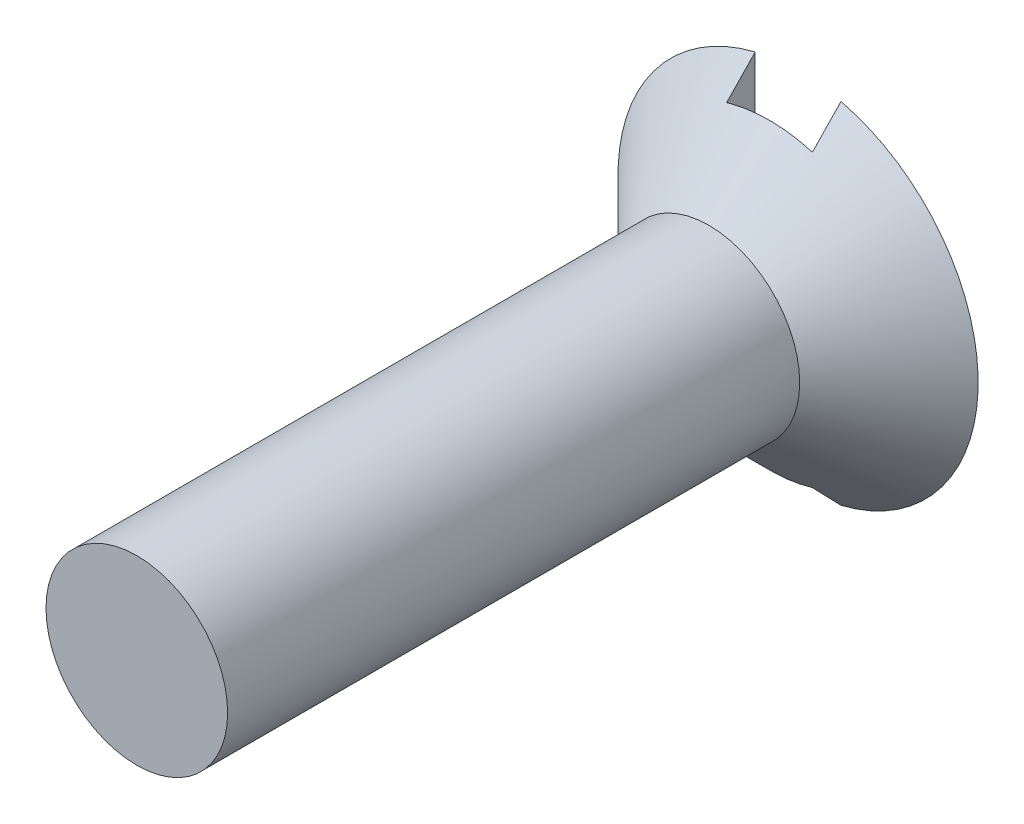
ISO-10303-21;
HEADER;
FILE_DESCRIPTION(('STEP AP214'),'2;1');
FILE_NAME('part.step','',(''),(''),'','','');
FILE_SCHEMA(('AUTOMOTIVE_DESIGN { 1 0 10303 214 1 1 1 1 }'));
ENDSEC;
DATA;
#1=APPLICATION_CONTEXT('core data for automotive mechanical design processes');
#2=APPLICATION_PROTOCOL_DEFINITION('international standard','automotive_design',2000,#1);
#3=PRODUCT_CONTEXT('',#1,'mechanical');
#4=PRODUCT('Part','Part','',(#3));
#5=PRODUCT_RELATED_PRODUCT_CATEGORY('part','',(#4));
#6=PRODUCT_DEFINITION_FORMATION('','',#4);
#7=PRODUCT_DEFINITION_CONTEXT('part definition',#1,'design');
#8=PRODUCT_DEFINITION('design','',#6,#7);
#9=PRODUCT_DEFINITION_SHAPE('','',#8);
#10=(LENGTH_UNIT() NAMED_UNIT(*) SI_UNIT(.MILLI.,.METRE.));
#11=(NAMED_UNIT(*) PLANE_ANGLE_UNIT() SI_UNIT($,.RADIAN.));
#12=(NAMED_UNIT(*) SI_UNIT($,.STERADIAN.) SOLID_ANGLE_UNIT());
#13=UNCERTAINTY_MEASURE_WITH_UNIT(LENGTH_MEASURE(1.E-05),#10,'distance_accuracy_value','');
#14=(GEOMETRIC_REPRESENTATION_CONTEXT(3) GLOBAL_UNCERTAINTY_ASSIGNED_CONTEXT((#13)) GLOBAL_UNIT_ASSIGNED_CONTEXT((#10,
#11,#12)) REPRESENTATION_CONTEXT('',''));
#15=CARTESIAN_POINT('',(0.,0.,0.));
#16=DIRECTION('',(0.,0.,1.));
#17=DIRECTION('',(1.,0.,0.));
#18=AXIS2_PLACEMENT_3D('',#15,#16,#17);
#19=CARTESIAN_POINT('',(0.,0.,0.));
#20=DIRECTION('',(0.,0.,1.));
#21=DIRECTION('',(0.,-1.,0.));
#22=AXIS2_PLACEMENT_3D('',#19,#20,#21);
#23=PLANE('',#22);
#24=CARTESIAN_POINT('',(0.,0.,0.));
#25=DIRECTION('',(0.,0.,1.));
#26=DIRECTION('',(0.,-1.,0.));
#27=AXIS2_PLACEMENT_3D('',#24,#25,#26);
#28=CIRCLE('',#27,3.14750000000002);
#29=CARTESIAN_POINT('',(-0.75,3.05683762244581,0.));
#30=VERTEX_POINT('',#29);
#31=CARTESIAN_POINT('',(-0.75,-3.05683762244581,0.));
#32=VERTEX_POINT('',#31);
#33=EDGE_CURVE('E87',#30,#32,#28,.T.);
#34=ORIENTED_EDGE('',*,*,#33,.F.);
#35=DIRECTION('',(0.,1.,0.));
#36=VECTOR('',#35,1.);
#37=CARTESIAN_POINT('',(-0.75,3.5,0.));
#38=LINE('',#37,#36);
#39=EDGE_CURVE('E80',#32,#30,#38,.T.);
#40=ORIENTED_EDGE('',*,*,#39,.F.);
#41=EDGE_LOOP('',(#34,#40));
#42=FACE_BOUND('',#41,.T.);
#43=ADVANCED_FACE('F33',(#42),#23,.F.);
#44=CARTESIAN_POINT('',(0.75,-3.05683762244581,0.));
#45=VERTEX_POINT('',#44);
#46=CARTESIAN_POINT('',(0.75,3.05683762244581,0.));
#47=VERTEX_POINT('',#46);
#48=EDGE_CURVE('E93',#45,#47,#28,.T.);
#49=ORIENTED_EDGE('',*,*,#48,.F.);
#50=DIRECTION('',(0.,-1.,0.));
#51=VECTOR('',#50,1.);
#52=CARTESIAN_POINT('',(0.75,3.5,0.));
#53=LINE('',#52,#51);
#54=EDGE_CURVE('E88',#47,#45,#53,.T.);
#55=ORIENTED_EDGE('',*,*,#54,.F.);
#56=EDGE_LOOP('',(#49,#55));
#57=FACE_BOUND('',#56,.T.);
#58=ADVANCED_FACE('F35',(#57),#23,.F.);
#59=CARTESIAN_POINT('',(0.,0.,0.));
#60=DIRECTION('',(0.,0.,-1.));
#61=DIRECTION('',(0.,1.,0.));
#62=AXIS2_PLACEMENT_3D('',#59,#60,#61);
#63=CONICAL_SURFACE('',#62,3.14750000000002,0.785398163397454);
#64=ORIENTED_EDGE('',*,*,#33,.T.);
#65=CARTESIAN_POINT('',(-0.750000000000001,-6.89593046146659,-3.78909548549445));
#66=CARTESIAN_POINT('',(-0.750000000000001,-6.69919737227802,-3.59352007695403));
#67=CARTESIAN_POINT('',(-0.750000000000001,-6.50241954572751,-3.39798963634074));
#68=CARTESIAN_POINT('',(-0.750000000000001,-6.10870506111789,-3.00702862505981));
#69=CARTESIAN_POINT('',(-0.750000000000001,-5.9117683834006,-2.81159807419011));
#70=CARTESIAN_POINT('',(-0.750000000000001,-5.51703585181104,-2.42022135821154));
#71=CARTESIAN_POINT('',(-0.750000000000001,-5.31923940711723,-2.22427578874067));
#72=CARTESIAN_POINT('',(-0.750000000000001,-4.92343879191606,-1.83265430565398));
#73=CARTESIAN_POINT('',(-0.750000000000001,-4.72543465719385,-1.63697835585986));
#74=CARTESIAN_POINT('',(-0.750000000000001,-4.242446771821,-1.16047212321531));
#75=CARTESIAN_POINT('',(-0.750000000000001,-3.95728755256811,-0.879819355619668));
#76=CARTESIAN_POINT('',(-0.750000000000001,-3.52851932202638,-0.459736194794578));
#77=CARTESIAN_POINT('',(-0.750000000000001,-3.38538625743235,-0.319820180057222));
#78=CARTESIAN_POINT('',(-0.750000000000001,-3.09866477831175,-0.0404722879723133));
#79=CARTESIAN_POINT('',(-0.75,-2.95507639188266,0.0989596181780465));
#80=CARTESIAN_POINT('',(-0.75,-2.66766146237941,0.376660607676931));
#81=CARTESIAN_POINT('',(-0.75,-2.52383713131528,0.514931979444848));
#82=CARTESIAN_POINT('',(-0.75,-2.23506259915002,0.790365963711837));
#83=CARTESIAN_POINT('',(-0.75,-2.09011214801799,0.927528315331509));
#84=CARTESIAN_POINT('',(-0.75,-1.87131177281811,1.13165373046293));
#85=CARTESIAN_POINT('',(-0.75,-1.7981861796293,1.19939231577637));
#86=CARTESIAN_POINT('',(-0.75,-1.65126110675421,1.33413369367998));
#87=CARTESIAN_POINT('',(-0.75,-1.57746164217552,1.40113650269176));
#88=CARTESIAN_POINT('',(-0.75,-1.42892863197197,1.53404468071364));
#89=CARTESIAN_POINT('',(-0.75,-1.35419544164256,1.59995044616113));
#90=CARTESIAN_POINT('',(-0.75,-1.20331133792206,1.7301143223386));
#91=CARTESIAN_POINT('',(-0.75,-1.12716064132324,1.79437268150546));
#92=CARTESIAN_POINT('',(-0.75,-1.02011532275803,1.88146564549445));
#93=CARTESIAN_POINT('',(-0.75,-0.990180862812598,1.90547908325866));
#94=CARTESIAN_POINT('',(-0.75,-0.929897961692978,1.95298594120127));
#95=CARTESIAN_POINT('',(-0.75,-0.899549495135915,1.97647932926157));
#96=CARTESIAN_POINT('',(-0.75,-0.838278743857084,2.02286238024287));
#97=CARTESIAN_POINT('',(-0.75,-0.807355260102752,2.04575046445957));
#98=CARTESIAN_POINT('',(-0.75,-0.744891408733915,2.09066904822445));
#99=CARTESIAN_POINT('',(-0.75,-0.713351078905262,2.1126996000564));
#100=CARTESIAN_POINT('',(-0.75,-0.650328907966391,2.15507995014121));
#101=CARTESIAN_POINT('',(-0.75,-0.61886645808723,2.17545841461842));
#102=CARTESIAN_POINT('',(-0.75,-0.55504082352416,2.21479532801643));
#103=CARTESIAN_POINT('',(-0.75,-0.522677295532234,2.23375322526354));
#104=CARTESIAN_POINT('',(-0.75,-0.457006690099744,2.26966068883512));
#105=CARTESIAN_POINT('',(-0.75,-0.423703769482834,2.28661777553784));
#106=CARTESIAN_POINT('',(-0.75,-0.355885080100762,2.31789153466465));
#107=CARTESIAN_POINT('',(-0.75,-0.321370370940491,2.33221044869804));
#108=CARTESIAN_POINT('',(-0.75,-0.264156107450953,2.35260655459168));
#109=CARTESIAN_POINT('',(-0.75,-0.24184506579286,2.35976685728328));
#110=CARTESIAN_POINT('',(-0.75,-0.19675564777938,2.37242458602254));
#111=CARTESIAN_POINT('',(-0.75,-0.173977225909706,2.377921849292));
#112=CARTESIAN_POINT('',(-0.75,-0.105281073636108,2.39146087806094));
#113=CARTESIAN_POINT('',(-0.75,-0.0587406939787904,2.39664898226938));
#114=CARTESIAN_POINT('',(-0.75,0.0347002260592814,2.39815839421711));
#115=CARTESIAN_POINT('',(-0.75,0.0816014254353588,2.39443728475025));
#116=CARTESIAN_POINT('',(-0.75,0.174182078014178,2.37891065655009));
#117=CARTESIAN_POINT('',(-0.75,0.219854841867844,2.36706765438307));
#118=CARTESIAN_POINT('',(-0.75,0.310997129222837,2.33676931117565));
#119=CARTESIAN_POINT('',(-0.75,0.356376862641832,2.31805618949188));
#120=CARTESIAN_POINT('',(-0.75,0.445104429433316,2.27624623474514));
#121=CARTESIAN_POINT('',(-0.75,0.488448345966413,2.25314135093481));
#122=CARTESIAN_POINT('',(-0.75,0.573742876057505,2.20385697551348));
#123=CARTESIAN_POINT('',(-0.75,0.615680998635822,2.17765625692145));
#124=CARTESIAN_POINT('',(-0.75,0.698192664615256,2.12328657538207));
#125=CARTESIAN_POINT('',(-0.75,0.738767364468222,2.09511934621491));
#126=CARTESIAN_POINT('',(-0.75,0.82246531690316,2.03483069345652));
#127=CARTESIAN_POINT('',(-0.75,0.865494970492441,2.0025802396449));
#128=CARTESIAN_POINT('',(-0.75,0.950658080552743,1.9369130409152));
#129=CARTESIAN_POINT('',(-0.75,0.992791415372068,1.90349613928751));
#130=CARTESIAN_POINT('',(-0.75,1.1182162737197,1.80196251586647));
#131=CARTESIAN_POINT('',(-0.75,1.20049113086593,1.73259382749413));
#132=CARTESIAN_POINT('',(-0.75,1.36353808846967,1.5918429367997));
#133=CARTESIAN_POINT('',(-0.75,1.44430720917192,1.5204573268482));
#134=CARTESIAN_POINT('',(-0.75,1.60473901816051,1.37650163536918));
#135=CARTESIAN_POINT('',(-0.75,1.68440201865759,1.30393190118827));
#136=CARTESIAN_POINT('',(-0.75,1.84277090789677,1.15819074310065));
#137=CARTESIAN_POINT('',(-0.75,1.92147881971342,1.08502151008934));
#138=CARTESIAN_POINT('',(-0.75,2.07837305344387,0.938115312370894));
#139=CARTESIAN_POINT('',(-0.75,2.15655933724438,0.864378307008716));
#140=CARTESIAN_POINT('',(-0.75,2.39037832106715,0.642719977142757));
#141=CARTESIAN_POINT('',(-0.75,2.54543880631363,0.494195664012472));
#142=CARTESIAN_POINT('',(-0.75,2.87697988161704,0.17474038044657));
#143=CARTESIAN_POINT('',(-0.75,3.05332367287934,0.00366787620418381));
#144=CARTESIAN_POINT('',(-0.75,3.40531062850513,-0.339200059897106));
#145=CARTESIAN_POINT('',(-0.75,3.58095378420247,-0.510995500644323));
#146=CARTESIAN_POINT('',(-0.75,4.10737504377805,-1.02721167861243));
#147=CARTESIAN_POINT('',(-0.749999999999999,4.45748809596326,-1.37231004372362));
#148=CARTESIAN_POINT('',(-0.749999999999999,5.15600692466705,-2.06250423511715));
#149=CARTESIAN_POINT('',(-0.749999999999999,5.50441478211481,-2.40759795950398));
#150=CARTESIAN_POINT('',(-0.749999999999999,6.02657581151583,-2.92552498546173));
#151=CARTESIAN_POINT('',(-0.749999999999999,6.20051242005254,-3.09817334767259));
#152=CARTESIAN_POINT('',(-0.749999999999999,6.54828819261336,-3.44356755730273));
#153=CARTESIAN_POINT('',(-0.749999999999999,6.72212735681505,-3.61631340454317));
#154=CARTESIAN_POINT('',(-0.749999999999999,6.89593046146659,-3.78909548549444));
#155=B_SPLINE_CURVE_WITH_KNOTS('',3,(#65,#66,#67,#68,#69,#70,#71,#72,#73,#74,#75,#76,#77,#78,
#79,#80,#81,#82,#83,#84,#85,#86,#87,#88,#89,#90,#91,#92,#93,#94,#95,#96,#97,#98,#99,#100,#101,
#102,#103,#104,#105,#106,#107,#108,#109,#110,#111,#112,#113,#114,#115,#116,#117,#118,#119,#120,
#121,#122,#123,#124,#125,#126,#127,#128,#129,#130,#131,#132,#133,#134,#135,#136,#137,#138,#139,
#140,#141,#142,#143,#144,#145,#146,#147,#148,#149,#150,#151,#152,#153,#154),.UNSPECIFIED.,.F.,
.F.,(4,2,2,2,2,2,2,2,2,2,2,2,2,2,2,2,2,2,2,2,2,2,2,2,2,2,2,2,2,2,2,2,2,2,2,2,2,2,2,2,2,2,2,2,4),
(0.,0.832215643496161,1.66455830672349,2.49982027520999,3.3349564046729,4.53526007642662,
5.13573599840682,5.73617555994846,6.33470434279278,6.93337004698715,7.23240340095294,
7.53143006724241,7.83034622000193,8.12921702638421,8.24434064316957,8.35947135022866,
8.47487747767069,8.59027655773938,8.7027052831199,8.81517744603227,8.92721240387344,
9.03915172407685,9.1093894095337,9.17963396762776,9.31929289025708,9.45961805709913,
9.60059523724016,9.74751739566527,9.89471152786409,10.0429809087639,10.1911211792501,
10.3524150688234,10.5137307119055,10.836517224509,11.1598862279307,11.4831620225082,
11.8055528693372,12.127967019533,12.7721090092503,13.5091723665726,14.2462448125255,
15.7210454079302,17.1922008590699,17.927423638179,18.6626450729009),.UNSPECIFIED.);
#156=CARTESIAN_POINT('',(-0.75,-2.53904632687158,0.5));
#157=VERTEX_POINT('',#156);
#158=EDGE_CURVE('E11',#32,#157,#155,.T.);
#159=ORIENTED_EDGE('',*,*,#158,.T.);
#160=CARTESIAN_POINT('',(0.,0.,0.5));
#161=DIRECTION('',(0.,0.,-1.));
#162=DIRECTION('',(0.,1.,0.));
#163=AXIS2_PLACEMENT_3D('',#160,#161,#162);
#164=CIRCLE('',#163,2.64750000000002);
#165=CARTESIAN_POINT('',(0.75,-2.53904632687158,0.5));
#166=VERTEX_POINT('',#165);
#167=EDGE_CURVE('E104',#166,#157,#164,.T.);
#168=ORIENTED_EDGE('',*,*,#167,.F.);
#169=CARTESIAN_POINT('',(0.750000000000001,6.8959304614666,-3.78909548549445));
#170=CARTESIAN_POINT('',(0.750000000000001,6.69919737227803,-3.59352007695403));
#171=CARTESIAN_POINT('',(0.750000000000001,6.50241954572752,-3.39798963634075));
#172=CARTESIAN_POINT('',(0.750000000000001,6.1087050611179,-3.00702862505982));
#173=CARTESIAN_POINT('',(0.750000000000001,5.91176838340061,-2.81159807419012));
#174=CARTESIAN_POINT('',(0.750000000000001,5.51703585181106,-2.42022135821156));
#175=CARTESIAN_POINT('',(0.750000000000001,5.31923940711725,-2.22427578874069));
#176=CARTESIAN_POINT('',(0.750000000000001,4.92343879191608,-1.832654305654));
#177=CARTESIAN_POINT('',(0.750000000000001,4.72543465719387,-1.63697835585988));
#178=CARTESIAN_POINT('',(0.75,4.24244677182102,-1.16047212321534));
#179=CARTESIAN_POINT('',(0.75,3.95728755256813,-0.879819355619687));
#180=CARTESIAN_POINT('',(0.75,3.5285193220264,-0.459736194794594));
#181=CARTESIAN_POINT('',(0.75,3.38538625743236,-0.319820180057238));
#182=CARTESIAN_POINT('',(0.75,3.09866477831176,-0.0404722879723267));
#183=CARTESIAN_POINT('',(0.75,2.95507639188267,0.098959618178034));
#184=CARTESIAN_POINT('',(0.75,2.66766146237942,0.376660607676921));
#185=CARTESIAN_POINT('',(0.75,2.52383713131529,0.514931979444839));
#186=CARTESIAN_POINT('',(0.75,2.23506259915003,0.79036596371183));
#187=CARTESIAN_POINT('',(0.75,2.09011214801799,0.927528315331503));
#188=CARTESIAN_POINT('',(0.75,1.87131177281811,1.13165373046292));
#189=CARTESIAN_POINT('',(0.75,1.79818617962931,1.19939231577637));
#190=CARTESIAN_POINT('',(0.75,1.65126110675422,1.33413369367997));
#191=CARTESIAN_POINT('',(0.75,1.57746164217552,1.40113650269176));
#192=CARTESIAN_POINT('',(0.75,1.42892863197198,1.53404468071364));
#193=CARTESIAN_POINT('',(0.75,1.35419544164256,1.59995044616113));
#194=CARTESIAN_POINT('',(0.75,1.20331133792207,1.7301143223386));
#195=CARTESIAN_POINT('',(0.75,1.12716064132324,1.79437268150546));
#196=CARTESIAN_POINT('',(0.75,1.02011532275803,1.88146564549445));
#197=CARTESIAN_POINT('',(0.75,0.990180862812598,1.90547908325866));
#198=CARTESIAN_POINT('',(0.75,0.929897961692978,1.95298594120127));
#199=CARTESIAN_POINT('',(0.75,0.899549495135915,1.97647932926157));
#200=CARTESIAN_POINT('',(0.75,0.838278743857084,2.02286238024287));
#201=CARTESIAN_POINT('',(0.75,0.807355260102752,2.04575046445957));
#202=CARTESIAN_POINT('',(0.75,0.744891408733914,2.09066904822445));
#203=CARTESIAN_POINT('',(0.75,0.713351078905261,2.1126996000564));
#204=CARTESIAN_POINT('',(0.75,0.650328907966389,2.15507995014121));
#205=CARTESIAN_POINT('',(0.75,0.618866458087229,2.17545841461842));
#206=CARTESIAN_POINT('',(0.75,0.555040823524158,2.21479532801643));
#207=CARTESIAN_POINT('',(0.75,0.522677295532232,2.23375322526354));
#208=CARTESIAN_POINT('',(0.75,0.457006690099742,2.26966068883512));
#209=CARTESIAN_POINT('',(0.75,0.423703769482832,2.28661777553784));
#210=CARTESIAN_POINT('',(0.75,0.35588508010076,2.31789153466465));
#211=CARTESIAN_POINT('',(0.75,0.321370370940489,2.33221044869804));
#212=CARTESIAN_POINT('',(0.75,0.264156107450952,2.35260655459168));
#213=CARTESIAN_POINT('',(0.75,0.241845065792859,2.35976685728328));
#214=CARTESIAN_POINT('',(0.75,0.196755647779379,2.37242458602254));
#215=CARTESIAN_POINT('',(0.75,0.173977225909704,2.377921849292));
#216=CARTESIAN_POINT('',(0.75,0.105281073636106,2.39146087806094));
#217=CARTESIAN_POINT('',(0.75,0.0587406939787891,2.39664898226938));
#218=CARTESIAN_POINT('',(0.75,-0.0347002260592816,2.3981583942171));
#219=CARTESIAN_POINT('',(0.75,-0.0816014254353583,2.39443728475025));
#220=CARTESIAN_POINT('',(0.75,-0.174182078014178,2.37891065655009));
#221=CARTESIAN_POINT('',(0.75,-0.219854841867844,2.36706765438307));
#222=CARTESIAN_POINT('',(0.75,-0.310997129222837,2.33676931117565));
#223=CARTESIAN_POINT('',(0.75,-0.356376862641832,2.31805618949188));
#224=CARTESIAN_POINT('',(0.75,-0.445104429433316,2.27624623474514));
#225=CARTESIAN_POINT('',(0.75,-0.488448345966412,2.25314135093481));
#226=CARTESIAN_POINT('',(0.75,-0.573742876057504,2.20385697551348));
#227=CARTESIAN_POINT('',(0.75,-0.615680998635821,2.17765625692145));
#228=CARTESIAN_POINT('',(0.75,-0.698192664615256,2.12328657538207));
#229=CARTESIAN_POINT('',(0.75,-0.738767364468223,2.09511934621491));
#230=CARTESIAN_POINT('',(0.75,-0.822465316903161,2.03483069345652));
#231=CARTESIAN_POINT('',(0.75,-0.865494970492442,2.0025802396449));
#232=CARTESIAN_POINT('',(0.75,-0.950658080552744,1.9369130409152));
#233=CARTESIAN_POINT('',(0.75,-0.992791415372069,1.90349613928751));
#234=CARTESIAN_POINT('',(0.75,-1.1182162737197,1.80196251586647));
#235=CARTESIAN_POINT('',(0.75,-1.20049113086593,1.73259382749413));
#236=CARTESIAN_POINT('',(0.75,-1.36353808846967,1.5918429367997));
#237=CARTESIAN_POINT('',(0.75,-1.44430720917192,1.5204573268482));
#238=CARTESIAN_POINT('',(0.75,-1.60473901816051,1.37650163536918));
#239=CARTESIAN_POINT('',(0.75,-1.6844020186576,1.30393190118827));
#240=CARTESIAN_POINT('',(0.75,-1.84277090789677,1.15819074310065));
#241=CARTESIAN_POINT('',(0.75,-1.92147881971342,1.08502151008934));
#242=CARTESIAN_POINT('',(0.75,-2.07837305344388,0.938115312370891));
#243=CARTESIAN_POINT('',(0.75,-2.15655933724438,0.864378307008713));
#244=CARTESIAN_POINT('',(0.75,-2.39037832106715,0.642719977142754));
#245=CARTESIAN_POINT('',(0.75,-2.54543880631363,0.494195664012469));
#246=CARTESIAN_POINT('',(0.75,-2.87697988161705,0.174740380446566));
#247=CARTESIAN_POINT('',(0.749999999999999,-3.05332367287934,0.00366787620418015));
#248=CARTESIAN_POINT('',(0.749999999999999,-3.40531062850513,-0.33920005989711));
#249=CARTESIAN_POINT('',(0.749999999999999,-3.58095378420247,-0.510995500644327));
#250=CARTESIAN_POINT('',(0.749999999999999,-4.10737504377806,-1.02721167861243));
#251=CARTESIAN_POINT('',(0.749999999999999,-4.45748809596327,-1.37231004372363));
#252=CARTESIAN_POINT('',(0.749999999999999,-5.15600692466705,-2.06250423511715));
#253=CARTESIAN_POINT('',(0.749999999999999,-5.50441478211482,-2.40759795950399));
#254=CARTESIAN_POINT('',(0.749999999999999,-6.02657581151583,-2.92552498546174));
#255=CARTESIAN_POINT('',(0.749999999999999,-6.20051242005255,-3.0981733476726));
#256=CARTESIAN_POINT('',(0.749999999999999,-6.54828819261336,-3.44356755730273));
#257=CARTESIAN_POINT('',(0.749999999999999,-6.72212735681506,-3.61631340454318));
#258=CARTESIAN_POINT('',(0.749999999999999,-6.8959304614666,-3.78909548549445));
#259=B_SPLINE_CURVE_WITH_KNOTS('',3,(#169,#170,#171,#172,#173,#174,#175,#176,#177,#178,#179,
#180,#181,#182,#183,#184,#185,#186,#187,#188,#189,#190,#191,#192,#193,#194,#195,#196,#197,#198,
#199,#200,#201,#202,#203,#204,#205,#206,#207,#208,#209,#210,#211,#212,#213,#214,#215,#216,#217,
#218,#219,#220,#221,#222,#223,#224,#225,#226,#227,#228,#229,#230,#231,#232,#233,#234,#235,#236,
#237,#238,#239,#240,#241,#242,#243,#244,#245,#246,#247,#248,#249,#250,#251,#252,#253,#254,#255,
#256,#257,#258),.UNSPECIFIED.,.F.,.F.,(4,2,2,2,2,2,2,2,2,2,2,2,2,2,2,2,2,2,2,2,2,2,2,2,2,2,2,2,
2,2,2,2,2,2,2,2,2,2,2,2,2,2,2,2,4),(0.,0.832215643496155,1.66455830672348,2.49982027520997,
3.33495640467288,4.53526007642661,5.13573599840681,5.73617555994845,6.33470434279277,
6.93337004698715,7.23240340095294,7.53143006724242,7.83034622000194,8.12921702638422,
8.24434064316958,8.35947135022867,8.4748774776707,8.59027655773939,8.70270528311991,
8.81517744603228,8.92721240387345,9.03915172407687,9.10938940953371,9.17963396762777,
9.31929289025709,9.45961805709914,9.60059523724018,9.74751739566528,9.8947115278641,
10.0429809087639,10.1911211792501,10.3524150688234,10.5137307119055,10.836517224509,
11.1598862279307,11.4831620225082,11.8055528693373,12.127967019533,12.7721090092503,
13.5091723665727,14.2462448125256,15.7210454079303,17.1922008590699,17.927423638179,
18.6626450729009),.UNSPECIFIED.);
#260=EDGE_CURVE('E47',#166,#45,#259,.T.);
#261=ORIENTED_EDGE('',*,*,#260,.T.);
#262=ORIENTED_EDGE('',*,*,#48,.T.);
#263=CARTESIAN_POINT('',(0.75,2.53904632687158,0.5));
#264=VERTEX_POINT('',#263);
#265=EDGE_CURVE('E103',#47,#264,#259,.T.);
#266=ORIENTED_EDGE('',*,*,#265,.T.);
#267=CARTESIAN_POINT('',(-0.75,2.53904632687158,0.5));
#268=VERTEX_POINT('',#267);
#269=EDGE_CURVE('E97',#268,#264,#164,.T.);
#270=ORIENTED_EDGE('',*,*,#269,.F.);
#271=EDGE_CURVE('E37',#268,#30,#155,.T.);
#272=ORIENTED_EDGE('',*,*,#271,.T.);
#273=EDGE_LOOP('',(#64,#159,#168,#261,#262,#266,#270,#272));
#274=FACE_BOUND('',#273,.T.);
#275=CARTESIAN_POINT('',(0.,0.,1.56));
#276=DIRECTION('',(0.,0.,1.));
#277=DIRECTION('',(0.,-1.,0.));
#278=AXIS2_PLACEMENT_3D('',#275,#276,#277);
#279=CIRCLE('',#278,1.5875);
#280=CARTESIAN_POINT('',(0.,-1.5875,1.56));
#281=VERTEX_POINT('',#280);
#282=EDGE_CURVE('E94',#281,#281,#279,.T.);
#283=ORIENTED_EDGE('',*,*,#282,.F.);
#284=EDGE_LOOP('',(#283));
#285=FACE_BOUND('',#284,.T.);
#286=ADVANCED_FACE('F90',(#274,#285),#63,.T.);
#287=CARTESIAN_POINT('',(0.,0.,11.56));
#288=DIRECTION('',(0.,0.,1.));
#289=DIRECTION('',(0.,-1.,0.));
#290=AXIS2_PLACEMENT_3D('',#287,#288,#289);
#291=CYLINDRICAL_SURFACE('',#290,1.5875);
#292=CARTESIAN_POINT('',(0.,0.,11.56));
#293=DIRECTION('',(0.,0.,1.));
#294=DIRECTION('',(0.,-1.,0.));
#295=AXIS2_PLACEMENT_3D('',#292,#293,#294);
#296=CIRCLE('',#295,1.5875);
#297=CARTESIAN_POINT('',(0.,-1.5875,11.56));
#298=VERTEX_POINT('',#297);
#299=EDGE_CURVE('E99',#298,#298,#296,.T.);
#300=ORIENTED_EDGE('',*,*,#299,.F.);
#301=EDGE_LOOP('',(#300));
#302=FACE_BOUND('',#301,.T.);
#303=ORIENTED_EDGE('',*,*,#282,.T.);
#304=EDGE_LOOP('',(#303));
#305=FACE_BOUND('',#304,.T.);
#306=ADVANCED_FACE('F123',(#302,#305),#291,.T.);
#307=CARTESIAN_POINT('',(0.,1.5875,11.56));
#308=DIRECTION('',(0.,0.,-1.));
#309=DIRECTION('',(0.,1.,0.));
#310=AXIS2_PLACEMENT_3D('',#307,#308,#309);
#311=PLANE('',#310);
#312=ORIENTED_EDGE('',*,*,#299,.T.);
#313=EDGE_LOOP('',(#312));
#314=FACE_BOUND('',#313,.T.);
#315=ADVANCED_FACE('F121',(#314),#311,.F.);
#316=CARTESIAN_POINT('',(-0.75,3.5,0.5));
#317=DIRECTION('',(-1.,0.,0.));
#318=DIRECTION('',(0.,-1.,0.));
#319=AXIS2_PLACEMENT_3D('',#316,#317,#318);
#320=PLANE('',#319);
#321=ORIENTED_EDGE('',*,*,#39,.T.);
#322=ORIENTED_EDGE('',*,*,#271,.F.);
#323=DIRECTION('',(0.,1.,0.));
#324=VECTOR('',#323,1.);
#325=CARTESIAN_POINT('',(-0.75,3.5,0.5));
#326=LINE('',#325,#324);
#327=EDGE_CURVE('E54',#157,#268,#326,.T.);
#328=ORIENTED_EDGE('',*,*,#327,.F.);
#329=ORIENTED_EDGE('',*,*,#158,.F.);
#330=EDGE_LOOP('',(#321,#322,#328,#329));
#331=FACE_BOUND('',#330,.T.);
#332=ADVANCED_FACE('F79',(#331),#320,.F.);
#333=CARTESIAN_POINT('',(0.75,3.5,0.5));
#334=DIRECTION('',(1.,0.,0.));
#335=DIRECTION('',(0.,1.,0.));
#336=AXIS2_PLACEMENT_3D('',#333,#334,#335);
#337=PLANE('',#336);
#338=ORIENTED_EDGE('',*,*,#54,.T.);
#339=ORIENTED_EDGE('',*,*,#260,.F.);
#340=DIRECTION('',(0.,-1.,0.));
#341=VECTOR('',#340,1.);
#342=CARTESIAN_POINT('',(0.75,3.5,0.5));
#343=LINE('',#342,#341);
#344=EDGE_CURVE('E141',#264,#166,#343,.T.);
#345=ORIENTED_EDGE('',*,*,#344,.F.);
#346=ORIENTED_EDGE('',*,*,#265,.F.);
#347=EDGE_LOOP('',(#338,#339,#345,#346));
#348=FACE_BOUND('',#347,.T.);
#349=ADVANCED_FACE('F113',(#348),#337,.F.);
#350=CARTESIAN_POINT('',(0.,0.,0.5));
#351=DIRECTION('',(0.,0.,-1.));
#352=DIRECTION('',(0.,1.,0.));
#353=AXIS2_PLACEMENT_3D('',#350,#351,#352);
#354=PLANE('',#353);
#355=ORIENTED_EDGE('',*,*,#167,.T.);
#356=ORIENTED_EDGE('',*,*,#327,.T.);
#357=ORIENTED_EDGE('',*,*,#269,.T.);
#358=ORIENTED_EDGE('',*,*,#344,.T.);
#359=EDGE_LOOP('',(#355,#356,#357,#358));
#360=FACE_BOUND('',#359,.T.);
#361=ADVANCED_FACE('F117',(#360),#354,.T.);
#362=CLOSED_SHELL('',(#43,#58,#286,#306,#315,#332,#349,#361));
#363=MANIFOLD_SOLID_BREP('B2',#362);
#364=ADVANCED_BREP_SHAPE_REPRESENTATION('',(#18,#363),#14);
#365=SHAPE_DEFINITION_REPRESENTATION(#9,#364);
ENDSEC;
END-ISO-10303-21;
